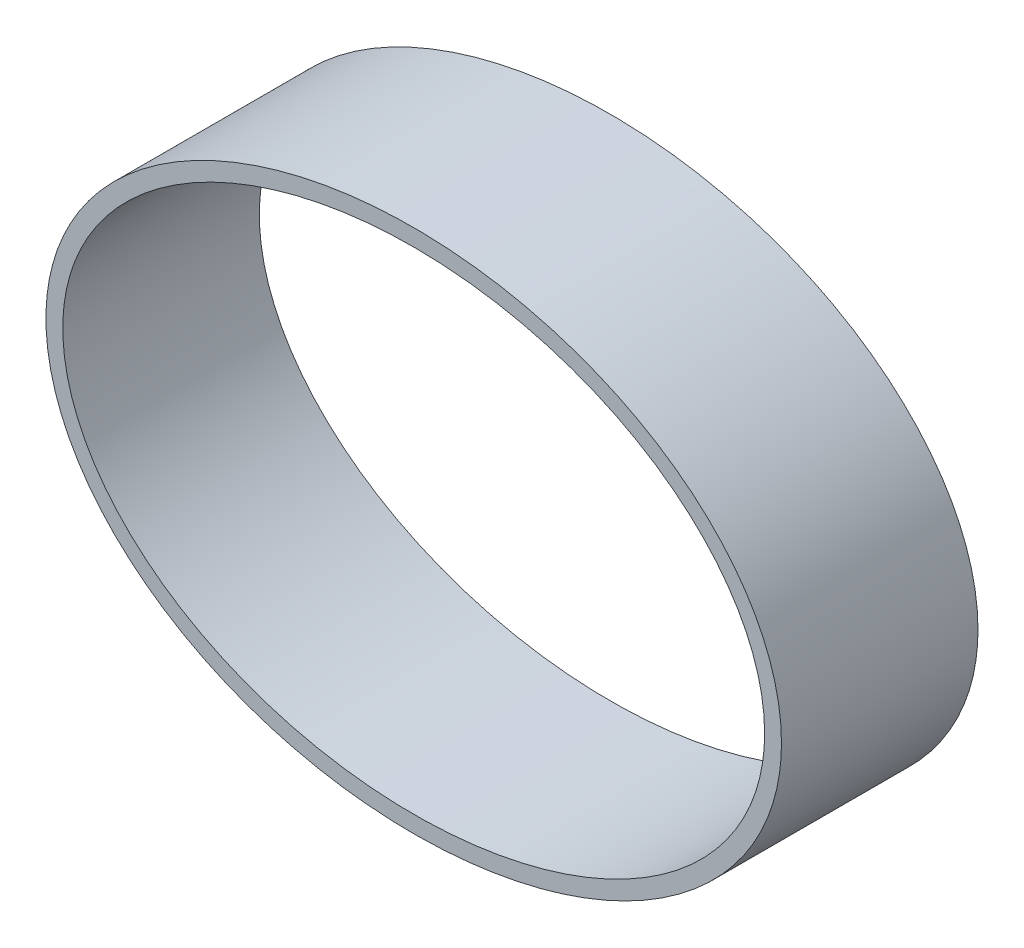
ISO-10303-21;
HEADER;
FILE_DESCRIPTION(('STEP AP214'),'2;1');
FILE_NAME('part.step','',(''),(''),'','','');
FILE_SCHEMA(('AUTOMOTIVE_DESIGN { 1 0 10303 214 1 1 1 1 }'));
ENDSEC;
DATA;
#1=APPLICATION_CONTEXT('core data for automotive mechanical design processes');
#2=APPLICATION_PROTOCOL_DEFINITION('international standard','automotive_design',2000,#1);
#3=PRODUCT_CONTEXT('',#1,'mechanical');
#4=PRODUCT('Part','Part','',(#3));
#5=PRODUCT_RELATED_PRODUCT_CATEGORY('part','',(#4));
#6=PRODUCT_DEFINITION_FORMATION('','',#4);
#7=PRODUCT_DEFINITION_CONTEXT('part definition',#1,'design');
#8=PRODUCT_DEFINITION('design','',#6,#7);
#9=PRODUCT_DEFINITION_SHAPE('','',#8);
#10=(LENGTH_UNIT() NAMED_UNIT(*) SI_UNIT(.MILLI.,.METRE.));
#11=(NAMED_UNIT(*) PLANE_ANGLE_UNIT() SI_UNIT($,.RADIAN.));
#12=(NAMED_UNIT(*) SI_UNIT($,.STERADIAN.) SOLID_ANGLE_UNIT());
#13=UNCERTAINTY_MEASURE_WITH_UNIT(LENGTH_MEASURE(1.E-05),#10,'distance_accuracy_value','');
#14=(GEOMETRIC_REPRESENTATION_CONTEXT(3) GLOBAL_UNCERTAINTY_ASSIGNED_CONTEXT((#13)) GLOBAL_UNIT_ASSIGNED_CONTEXT((#10,
#11,#12)) REPRESENTATION_CONTEXT('',''));
#15=CARTESIAN_POINT('',(0.,0.,0.));
#16=DIRECTION('',(0.,0.,1.));
#17=DIRECTION('',(1.,0.,0.));
#18=AXIS2_PLACEMENT_3D('',#15,#16,#17);
#19=CARTESIAN_POINT('',(-262.,0.,140.));
#20=DIRECTION('',(0.,0.,-1.));
#21=DIRECTION('',(-1.,0.,0.));
#22=AXIS2_PLACEMENT_3D('',#19,#20,#21);
#23=PLANE('',#22);
#24=CARTESIAN_POINT('',(262.,0.,140.));
#25=CARTESIAN_POINT('',(262.,12.5746997870486,140.));
#26=CARTESIAN_POINT('',(258.45148118644,37.7240993611458,140.));
#27=CARTESIAN_POINT('',(242.855814608625,73.628852509836,140.));
#28=CARTESIAN_POINT('',(217.908879577812,106.244468734417,140.));
#29=CARTESIAN_POINT('',(184.7948028939,134.456147174612,140.));
#30=CARTESIAN_POINT('',(144.861369420568,157.377761090382,140.));
#31=CARTESIAN_POINT('',(99.6194930410412,174.294611205257,140.));
#32=CARTESIAN_POINT('',(50.7363456949073,184.669135425003,140.));
#33=CARTESIAN_POINT('',(0.,188.165432287498,140.));
#34=CARTESIAN_POINT('',(-50.7363456949073,184.669135425003,140.));
#35=CARTESIAN_POINT('',(-99.6194930410412,174.294611205257,140.));
#36=CARTESIAN_POINT('',(-144.861369420568,157.377761090382,140.));
#37=CARTESIAN_POINT('',(-184.7948028939,134.456147174612,140.));
#38=CARTESIAN_POINT('',(-217.908879577812,106.244468734417,140.));
#39=CARTESIAN_POINT('',(-242.855814608625,73.628852509836,140.));
#40=CARTESIAN_POINT('',(-258.45148118644,37.7240993611458,140.));
#41=CARTESIAN_POINT('',(-263.77425940678,0.,140.));
#42=CARTESIAN_POINT('',(-258.45148118644,-37.7240993611458,140.));
#43=CARTESIAN_POINT('',(-242.855814608625,-73.628852509836,140.));
#44=CARTESIAN_POINT('',(-217.908879577812,-106.244468734417,140.));
#45=CARTESIAN_POINT('',(-184.7948028939,-134.456147174612,140.));
#46=CARTESIAN_POINT('',(-144.861369420568,-157.377761090382,140.));
#47=CARTESIAN_POINT('',(-99.6194930410412,-174.294611205257,140.));
#48=CARTESIAN_POINT('',(-50.7363456949074,-184.669135425003,140.));
#49=CARTESIAN_POINT('',(0.,-188.165432287498,140.));
#50=CARTESIAN_POINT('',(50.7363456949073,-184.669135425003,140.));
#51=CARTESIAN_POINT('',(99.6194930410412,-174.294611205257,140.));
#52=CARTESIAN_POINT('',(144.861369420568,-157.377761090382,140.));
#53=CARTESIAN_POINT('',(184.7948028939,-134.456147174612,140.));
#54=CARTESIAN_POINT('',(217.908879577812,-106.244468734417,140.));
#55=CARTESIAN_POINT('',(242.855814608625,-73.628852509836,140.));
#56=CARTESIAN_POINT('',(258.45148118644,-37.7240993611459,140.));
#57=CARTESIAN_POINT('',(262.,-12.5746997870486,140.));
#58=CARTESIAN_POINT('',(262.,0.,140.));
#59=B_SPLINE_CURVE_WITH_KNOTS('',3,(#24,#25,#26,#27,#28,#29,#30,#31,#32,#33,#34,#35,#36,#37,#38,
#39,#40,#41,#42,#43,#44,#45,#46,#47,#48,#49,#50,#51,#52,#53,#54,#55,#56,#57,#58),.UNSPECIFIED.,
.T.,.F.,(4,1,1,1,1,1,1,1,1,1,1,1,1,1,1,1,1,1,1,1,1,1,1,1,1,1,1,1,1,1,1,1,4),(0.,
0.196349540849362,0.392699081698724,0.589048622548086,0.785398163397448,0.98174770424681,
1.17809724509617,1.37444678594553,1.5707963267949,1.76714586764426,1.96349540849362,
2.15984494934298,2.35619449019234,2.55254403104171,2.74889357189107,2.94524311274043,
3.14159265358979,3.33794219443916,3.53429173528852,3.73064127613788,3.92699081698724,
4.1233403578366,4.31968989868597,4.51603943953533,4.71238898038469,4.90873852123405,
5.10508806208341,5.30143760293278,5.49778714378214,5.6941366846315,5.89048622548086,
6.08683576633022,6.28318530717959),.UNSPECIFIED.);
#60=CARTESIAN_POINT('',(262.,0.,140.));
#61=VERTEX_POINT('',#60);
#62=EDGE_CURVE('E12',#61,#61,#59,.T.);
#63=ORIENTED_EDGE('',*,*,#62,.T.);
#64=EDGE_LOOP('',(#63));
#65=FACE_BOUND('',#64,.T.);
#66=CARTESIAN_POINT('',(0.,0.,140.));
#67=DIRECTION('',(0.,0.,1.));
#68=DIRECTION('',(1.,0.,0.));
#69=AXIS2_PLACEMENT_3D('',#66,#67,#68);
#70=ELLIPSE('',#69,250.,175.);
#71=CARTESIAN_POINT('',(250.,0.,140.));
#72=VERTEX_POINT('',#71);
#73=EDGE_CURVE('E62',#72,#72,#70,.T.);
#74=ORIENTED_EDGE('',*,*,#73,.F.);
#75=EDGE_LOOP('',(#74));
#76=FACE_BOUND('',#75,.T.);
#77=ADVANCED_FACE('F49',(#65,#76),#23,.F.);
#78=CARTESIAN_POINT('',(-262.,0.,0.));
#79=DIRECTION('',(0.,0.,-1.));
#80=DIRECTION('',(-1.,0.,0.));
#81=AXIS2_PLACEMENT_3D('',#78,#79,#80);
#82=PLANE('',#81);
#83=CARTESIAN_POINT('',(262.,0.,0.));
#84=CARTESIAN_POINT('',(262.,12.5746997870486,0.));
#85=CARTESIAN_POINT('',(258.45148118644,37.7240993611458,0.));
#86=CARTESIAN_POINT('',(242.855814608625,73.628852509836,0.));
#87=CARTESIAN_POINT('',(217.908879577812,106.244468734417,0.));
#88=CARTESIAN_POINT('',(184.7948028939,134.456147174612,0.));
#89=CARTESIAN_POINT('',(144.861369420568,157.377761090382,0.));
#90=CARTESIAN_POINT('',(99.6194930410412,174.294611205257,0.));
#91=CARTESIAN_POINT('',(50.7363456949073,184.669135425003,0.));
#92=CARTESIAN_POINT('',(0.,188.165432287498,0.));
#93=CARTESIAN_POINT('',(-50.7363456949073,184.669135425003,0.));
#94=CARTESIAN_POINT('',(-99.6194930410412,174.294611205257,0.));
#95=CARTESIAN_POINT('',(-144.861369420568,157.377761090382,0.));
#96=CARTESIAN_POINT('',(-184.7948028939,134.456147174612,0.));
#97=CARTESIAN_POINT('',(-217.908879577812,106.244468734417,0.));
#98=CARTESIAN_POINT('',(-242.855814608625,73.628852509836,0.));
#99=CARTESIAN_POINT('',(-258.45148118644,37.7240993611458,0.));
#100=CARTESIAN_POINT('',(-263.77425940678,0.,0.));
#101=CARTESIAN_POINT('',(-258.45148118644,-37.7240993611458,0.));
#102=CARTESIAN_POINT('',(-242.855814608625,-73.628852509836,0.));
#103=CARTESIAN_POINT('',(-217.908879577812,-106.244468734417,0.));
#104=CARTESIAN_POINT('',(-184.7948028939,-134.456147174612,0.));
#105=CARTESIAN_POINT('',(-144.861369420568,-157.377761090382,0.));
#106=CARTESIAN_POINT('',(-99.6194930410412,-174.294611205257,0.));
#107=CARTESIAN_POINT('',(-50.7363456949074,-184.669135425003,0.));
#108=CARTESIAN_POINT('',(0.,-188.165432287498,0.));
#109=CARTESIAN_POINT('',(50.7363456949073,-184.669135425003,0.));
#110=CARTESIAN_POINT('',(99.6194930410412,-174.294611205257,0.));
#111=CARTESIAN_POINT('',(144.861369420568,-157.377761090382,0.));
#112=CARTESIAN_POINT('',(184.7948028939,-134.456147174612,0.));
#113=CARTESIAN_POINT('',(217.908879577812,-106.244468734417,0.));
#114=CARTESIAN_POINT('',(242.855814608625,-73.628852509836,0.));
#115=CARTESIAN_POINT('',(258.45148118644,-37.7240993611459,0.));
#116=CARTESIAN_POINT('',(262.,-12.5746997870486,0.));
#117=CARTESIAN_POINT('',(262.,0.,0.));
#118=B_SPLINE_CURVE_WITH_KNOTS('',3,(#83,#84,#85,#86,#87,#88,#89,#90,#91,#92,#93,#94,#95,#96,
#97,#98,#99,#100,#101,#102,#103,#104,#105,#106,#107,#108,#109,#110,#111,#112,#113,#114,#115,
#116,#117),.UNSPECIFIED.,.T.,.F.,(4,1,1,1,1,1,1,1,1,1,1,1,1,1,1,1,1,1,1,1,1,1,1,1,1,1,1,1,1,1,1,
1,4),(0.,0.196349540849362,0.392699081698724,0.589048622548086,0.785398163397448,
0.98174770424681,1.17809724509617,1.37444678594553,1.5707963267949,1.76714586764426,
1.96349540849362,2.15984494934298,2.35619449019234,2.55254403104171,2.74889357189107,
2.94524311274043,3.14159265358979,3.33794219443916,3.53429173528852,3.73064127613788,
3.92699081698724,4.1233403578366,4.31968989868597,4.51603943953533,4.71238898038469,
4.90873852123405,5.10508806208341,5.30143760293278,5.49778714378214,5.6941366846315,
5.89048622548086,6.08683576633022,6.28318530717959),.UNSPECIFIED.);
#119=CARTESIAN_POINT('',(262.,0.,0.));
#120=VERTEX_POINT('',#119);
#121=EDGE_CURVE('E54',#120,#120,#118,.T.);
#122=ORIENTED_EDGE('',*,*,#121,.F.);
#123=EDGE_LOOP('',(#122));
#124=FACE_BOUND('',#123,.T.);
#125=CARTESIAN_POINT('',(0.,0.,0.));
#126=DIRECTION('',(0.,0.,1.));
#127=DIRECTION('',(1.,0.,0.));
#128=AXIS2_PLACEMENT_3D('',#125,#126,#127);
#129=ELLIPSE('',#128,250.,175.);
#130=CARTESIAN_POINT('',(250.,0.,0.));
#131=VERTEX_POINT('',#130);
#132=EDGE_CURVE('E67',#131,#131,#129,.T.);
#133=ORIENTED_EDGE('',*,*,#132,.T.);
#134=EDGE_LOOP('',(#133));
#135=FACE_BOUND('',#134,.T.);
#136=ADVANCED_FACE('F81',(#124,#135),#82,.T.);
#137=DIRECTION('',(0.,0.,-1.));
#138=VECTOR('',#137,1.);
#139=SURFACE_OF_LINEAR_EXTRUSION('',#59,#138);
#140=ORIENTED_EDGE('',*,*,#62,.F.);
#141=EDGE_LOOP('',(#140));
#142=FACE_BOUND('',#141,.T.);
#143=ORIENTED_EDGE('',*,*,#121,.T.);
#144=EDGE_LOOP('',(#143));
#145=FACE_BOUND('',#144,.T.);
#146=ADVANCED_FACE('F51',(#142,#145),#139,.F.);
#147=DIRECTION('',(0.,0.,-1.));
#148=VECTOR('',#147,1.);
#149=SURFACE_OF_LINEAR_EXTRUSION('',#70,#148);
#150=ORIENTED_EDGE('',*,*,#73,.T.);
#151=EDGE_LOOP('',(#150));
#152=FACE_BOUND('',#151,.T.);
#153=ORIENTED_EDGE('',*,*,#132,.F.);
#154=EDGE_LOOP('',(#153));
#155=FACE_BOUND('',#154,.T.);
#156=ADVANCED_FACE('F76',(#152,#155),#149,.T.);
#157=CLOSED_SHELL('',(#77,#136,#146,#156));
#158=MANIFOLD_SOLID_BREP('B2',#157);
#159=ADVANCED_BREP_SHAPE_REPRESENTATION('',(#18,#158),#14);
#160=SHAPE_DEFINITION_REPRESENTATION(#9,#159);
ENDSEC;
END-ISO-10303-21;
